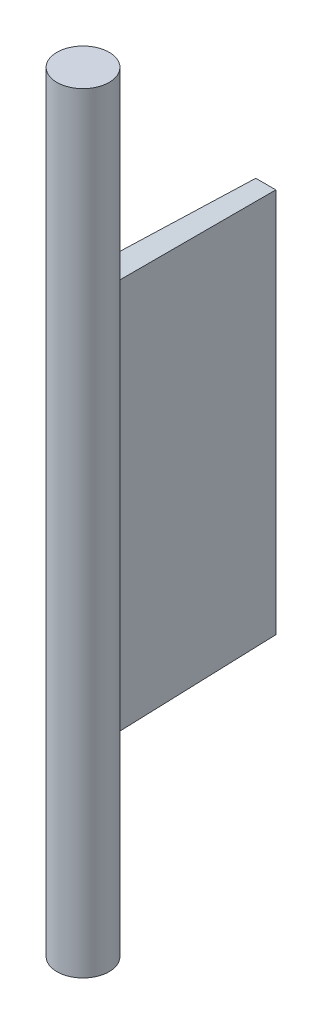
ISO-10303-21;
HEADER;
FILE_DESCRIPTION(('STEP AP214'),'2;1');
FILE_NAME('part.step','',(''),(''),'','','');
FILE_SCHEMA(('AUTOMOTIVE_DESIGN { 1 0 10303 214 1 1 1 1 }'));
ENDSEC;
DATA;
#1=APPLICATION_CONTEXT('core data for automotive mechanical design processes');
#2=APPLICATION_PROTOCOL_DEFINITION('international standard','automotive_design',2000,#1);
#3=PRODUCT_CONTEXT('',#1,'mechanical');
#4=PRODUCT('Part','Part','',(#3));
#5=PRODUCT_RELATED_PRODUCT_CATEGORY('part','',(#4));
#6=PRODUCT_DEFINITION_FORMATION('','',#4);
#7=PRODUCT_DEFINITION_CONTEXT('part definition',#1,'design');
#8=PRODUCT_DEFINITION('design','',#6,#7);
#9=PRODUCT_DEFINITION_SHAPE('','',#8);
#10=(LENGTH_UNIT() NAMED_UNIT(*) SI_UNIT(.MILLI.,.METRE.));
#11=(NAMED_UNIT(*) PLANE_ANGLE_UNIT() SI_UNIT($,.RADIAN.));
#12=(NAMED_UNIT(*) SI_UNIT($,.STERADIAN.) SOLID_ANGLE_UNIT());
#13=UNCERTAINTY_MEASURE_WITH_UNIT(LENGTH_MEASURE(1.E-05),#10,'distance_accuracy_value','');
#14=(GEOMETRIC_REPRESENTATION_CONTEXT(3) GLOBAL_UNCERTAINTY_ASSIGNED_CONTEXT((#13)) GLOBAL_UNIT_ASSIGNED_CONTEXT((#10,
#11,#12)) REPRESENTATION_CONTEXT('',''));
#15=CARTESIAN_POINT('',(0.,0.,0.));
#16=DIRECTION('',(0.,0.,1.));
#17=DIRECTION('',(1.,0.,0.));
#18=AXIS2_PLACEMENT_3D('',#15,#16,#17);
#19=CARTESIAN_POINT('',(0.,295.,0.));
#20=DIRECTION('',(0.,-1.,0.));
#21=DIRECTION('',(0.,0.,-1.));
#22=AXIS2_PLACEMENT_3D('',#19,#20,#21);
#23=CYLINDRICAL_SURFACE('',#22,10.);
#24=CARTESIAN_POINT('',(0.,222.5,0.));
#25=DIRECTION('',(0.,0.999847695156391,-0.0174524064372836));
#26=DIRECTION('',(0.,-0.0174524064372836,-0.999847695156391));
#27=AXIS2_PLACEMENT_3D('',#24,#25,#26);
#28=ELLIPSE('',#27,10.0015232804391,10.);
#29=CARTESIAN_POINT('',(4.91500962575065,222.347987848727,-8.7087703138146));
#30=VERTEX_POINT('',#29);
#31=CARTESIAN_POINT('',(-4.91500962575066,222.347987848727,-8.70877031381459));
#32=VERTEX_POINT('',#31);
#33=EDGE_CURVE('E44',#30,#32,#28,.T.);
#34=ORIENTED_EDGE('',*,*,#33,.T.);
#35=DIRECTION('',(0.,-1.,0.));
#36=VECTOR('',#35,1.);
#37=CARTESIAN_POINT('',(-4.91500962575067,295.,-8.70877031381459));
#38=LINE('',#37,#36);
#39=CARTESIAN_POINT('',(-4.91500962575064,72.6520121512726,-8.7087703138146));
#40=VERTEX_POINT('',#39);
#41=EDGE_CURVE('E11',#32,#40,#38,.T.);
#42=ORIENTED_EDGE('',*,*,#41,.T.);
#43=CARTESIAN_POINT('',(0.,72.5,0.));
#44=DIRECTION('',(0.,-0.999847695156391,-0.0174524064372836));
#45=DIRECTION('',(0.,-0.0174524064372836,0.999847695156391));
#46=AXIS2_PLACEMENT_3D('',#43,#44,#45);
#47=ELLIPSE('',#46,10.0015232804391,10.);
#48=CARTESIAN_POINT('',(4.91500962575068,72.6520121512726,-8.70877031381458));
#49=VERTEX_POINT('',#48);
#50=EDGE_CURVE('E106',#40,#49,#47,.T.);
#51=ORIENTED_EDGE('',*,*,#50,.T.);
#52=DIRECTION('',(0.,-1.,0.));
#53=VECTOR('',#52,1.);
#54=CARTESIAN_POINT('',(4.91500962575065,295.,-8.7087703138146));
#55=LINE('',#54,#53);
#56=EDGE_CURVE('E111',#49,#30,#55,.F.);
#57=ORIENTED_EDGE('',*,*,#56,.T.);
#58=EDGE_LOOP('',(#34,#42,#51,#57));
#59=FACE_BOUND('',#58,.T.);
#60=CARTESIAN_POINT('',(0.,295.,0.));
#61=DIRECTION('',(0.,1.,0.));
#62=DIRECTION('',(0.,0.,1.));
#63=AXIS2_PLACEMENT_3D('',#60,#61,#62);
#64=CIRCLE('',#63,10.);
#65=CARTESIAN_POINT('',(0.,295.,10.));
#66=VERTEX_POINT('',#65);
#67=EDGE_CURVE('E103',#66,#66,#64,.T.);
#68=ORIENTED_EDGE('',*,*,#67,.F.);
#69=EDGE_LOOP('',(#68));
#70=FACE_BOUND('',#69,.T.);
#71=CARTESIAN_POINT('',(0.,0.,0.));
#72=DIRECTION('',(0.,1.,0.));
#73=DIRECTION('',(0.,0.,1.));
#74=AXIS2_PLACEMENT_3D('',#71,#72,#73);
#75=CIRCLE('',#74,10.);
#76=CARTESIAN_POINT('',(0.,0.,10.));
#77=VERTEX_POINT('',#76);
#78=EDGE_CURVE('E81',#77,#77,#75,.T.);
#79=ORIENTED_EDGE('',*,*,#78,.T.);
#80=EDGE_LOOP('',(#79));
#81=FACE_BOUND('',#80,.T.);
#82=ADVANCED_FACE('F37',(#59,#70,#81),#23,.T.);
#83=CARTESIAN_POINT('',(0.,295.,0.));
#84=DIRECTION('',(0.,1.,0.));
#85=DIRECTION('',(0.,0.,1.));
#86=AXIS2_PLACEMENT_3D('',#83,#84,#85);
#87=PLANE('',#86);
#88=ORIENTED_EDGE('',*,*,#67,.T.);
#89=EDGE_LOOP('',(#88));
#90=FACE_BOUND('',#89,.T.);
#91=ADVANCED_FACE('F130',(#90),#87,.T.);
#92=CARTESIAN_POINT('',(0.,0.,0.));
#93=DIRECTION('',(0.,1.,0.));
#94=DIRECTION('',(0.,0.,1.));
#95=AXIS2_PLACEMENT_3D('',#92,#93,#94);
#96=PLANE('',#95);
#97=ORIENTED_EDGE('',*,*,#78,.F.);
#98=EDGE_LOOP('',(#97));
#99=FACE_BOUND('',#98,.T.);
#100=ADVANCED_FACE('F134',(#99),#96,.F.);
#101=CARTESIAN_POINT('',(-5.06702177702323,222.5,0.));
#102=DIRECTION('',(-0.999847695156391,0.,-0.0174524064372836));
#103=DIRECTION('',(-0.0174524064372836,0.,0.999847695156391));
#104=AXIS2_PLACEMENT_3D('',#101,#102,#103);
#105=PLANE('',#104);
#106=ORIENTED_EDGE('',*,*,#41,.F.);
#107=DIRECTION('',(-0.0174497491606827,0.0174497491606827,0.999695459881887));
#108=VECTOR('',#107,1.);
#109=CARTESIAN_POINT('',(-5.06393602414165,222.496914247118,-0.176782664187466));
#110=LINE('',#109,#108);
#111=CARTESIAN_POINT('',(-3.845167232048,221.278145455025,-69.9999999999998));
#112=VERTEX_POINT('',#111);
#113=EDGE_CURVE('E74',#112,#32,#110,.T.);
#114=ORIENTED_EDGE('',*,*,#113,.F.);
#115=DIRECTION('',(0.,-1.,0.));
#116=VECTOR('',#115,1.);
#117=CARTESIAN_POINT('',(-3.845167232048,222.5,-69.9999999999998));
#118=LINE('',#117,#116);
#119=CARTESIAN_POINT('',(-3.84516723204798,73.7218545449752,-69.9999999999998));
#120=VERTEX_POINT('',#119);
#121=EDGE_CURVE('E77',#112,#120,#118,.T.);
#122=ORIENTED_EDGE('',*,*,#121,.T.);
#123=DIRECTION('',(-0.0174497491606827,-0.0174497491606827,0.999695459881887));
#124=VECTOR('',#123,1.);
#125=CARTESIAN_POINT('',(-5.0213477151576,72.5456740618656,-2.61666525180184));
#126=LINE('',#125,#124);
#127=EDGE_CURVE('E95',#120,#40,#126,.T.);
#128=ORIENTED_EDGE('',*,*,#127,.T.);
#129=EDGE_LOOP('',(#106,#114,#122,#128));
#130=FACE_BOUND('',#129,.T.);
#131=ADVANCED_FACE('F76',(#130),#105,.T.);
#132=CARTESIAN_POINT('',(5.06702177702323,222.5,0.));
#133=DIRECTION('',(0.999847695156391,0.,-0.0174524064372836));
#134=DIRECTION('',(-0.0174524064372836,0.,-0.999847695156391));
#135=AXIS2_PLACEMENT_3D('',#132,#133,#134);
#136=PLANE('',#135);
#137=ORIENTED_EDGE('',*,*,#56,.F.);
#138=DIRECTION('',(0.0174497491606827,-0.0174497491606828,0.999695459881887));
#139=VECTOR('',#138,1.);
#140=CARTESIAN_POINT('',(5.06702177702325,72.5,0.));
#141=LINE('',#140,#139);
#142=CARTESIAN_POINT('',(3.84516723204801,73.7218545449752,-69.9999999999998));
#143=VERTEX_POINT('',#142);
#144=EDGE_CURVE('E51',#143,#49,#141,.T.);
#145=ORIENTED_EDGE('',*,*,#144,.F.);
#146=DIRECTION('',(0.,1.,0.));
#147=VECTOR('',#146,1.);
#148=CARTESIAN_POINT('',(3.845167232048,222.5,-69.9999999999998));
#149=LINE('',#148,#147);
#150=CARTESIAN_POINT('',(3.845167232048,221.278145455025,-69.9999999999998));
#151=VERTEX_POINT('',#150);
#152=EDGE_CURVE('E96',#143,#151,#149,.T.);
#153=ORIENTED_EDGE('',*,*,#152,.T.);
#154=DIRECTION('',(0.0174497491606827,0.0174497491606827,0.999695459881887));
#155=VECTOR('',#154,1.);
#156=CARTESIAN_POINT('',(5.06702177702323,222.5,0.));
#157=LINE('',#156,#155);
#158=EDGE_CURVE('E82',#151,#30,#157,.T.);
#159=ORIENTED_EDGE('',*,*,#158,.T.);
#160=EDGE_LOOP('',(#137,#145,#153,#159));
#161=FACE_BOUND('',#160,.T.);
#162=ADVANCED_FACE('F116',(#161),#136,.T.);
#163=CARTESIAN_POINT('',(5.06702177702323,222.5,0.));
#164=DIRECTION('',(0.,0.999847695156391,-0.0174524064372836));
#165=DIRECTION('',(0.,0.0174524064372836,0.999847695156391));
#166=AXIS2_PLACEMENT_3D('',#163,#164,#165);
#167=PLANE('',#166);
#168=ORIENTED_EDGE('',*,*,#33,.F.);
#169=ORIENTED_EDGE('',*,*,#158,.F.);
#170=DIRECTION('',(-1.,0.,0.));
#171=VECTOR('',#170,1.);
#172=CARTESIAN_POINT('',(5.06702177702323,221.278145455025,-69.9999999999998));
#173=LINE('',#172,#171);
#174=EDGE_CURVE('E89',#151,#112,#173,.T.);
#175=ORIENTED_EDGE('',*,*,#174,.T.);
#176=ORIENTED_EDGE('',*,*,#113,.T.);
#177=EDGE_LOOP('',(#168,#169,#175,#176));
#178=FACE_BOUND('',#177,.T.);
#179=ADVANCED_FACE('F92',(#178),#167,.T.);
#180=CARTESIAN_POINT('',(5.06702177702325,72.5,0.));
#181=DIRECTION('',(0.,-0.999847695156391,-0.0174524064372836));
#182=DIRECTION('',(0.,0.0174524064372836,-0.999847695156391));
#183=AXIS2_PLACEMENT_3D('',#180,#181,#182);
#184=PLANE('',#183);
#185=ORIENTED_EDGE('',*,*,#50,.F.);
#186=ORIENTED_EDGE('',*,*,#127,.F.);
#187=DIRECTION('',(1.,0.,0.));
#188=VECTOR('',#187,1.);
#189=CARTESIAN_POINT('',(5.06702177702325,73.7218545449752,-69.9999999999998));
#190=LINE('',#189,#188);
#191=EDGE_CURVE('E90',#120,#143,#190,.T.);
#192=ORIENTED_EDGE('',*,*,#191,.T.);
#193=ORIENTED_EDGE('',*,*,#144,.T.);
#194=EDGE_LOOP('',(#185,#186,#192,#193));
#195=FACE_BOUND('',#194,.T.);
#196=ADVANCED_FACE('F118',(#195),#184,.T.);
#197=CARTESIAN_POINT('',(0.,0.,-69.9999999999998));
#198=DIRECTION('',(0.,0.,-1.));
#199=DIRECTION('',(-1.,0.,0.));
#200=AXIS2_PLACEMENT_3D('',#197,#198,#199);
#201=PLANE('',#200);
#202=ORIENTED_EDGE('',*,*,#121,.F.);
#203=ORIENTED_EDGE('',*,*,#174,.F.);
#204=ORIENTED_EDGE('',*,*,#152,.F.);
#205=ORIENTED_EDGE('',*,*,#191,.F.);
#206=EDGE_LOOP('',(#202,#203,#204,#205));
#207=FACE_BOUND('',#206,.T.);
#208=ADVANCED_FACE('F87',(#207),#201,.T.);
#209=CLOSED_SHELL('',(#82,#91,#100,#131,#162,#179,#196,#208));
#210=MANIFOLD_SOLID_BREP('B2',#209);
#211=ADVANCED_BREP_SHAPE_REPRESENTATION('',(#18,#210),#14);
#212=SHAPE_DEFINITION_REPRESENTATION(#9,#211);
ENDSEC;
END-ISO-10303-21;
